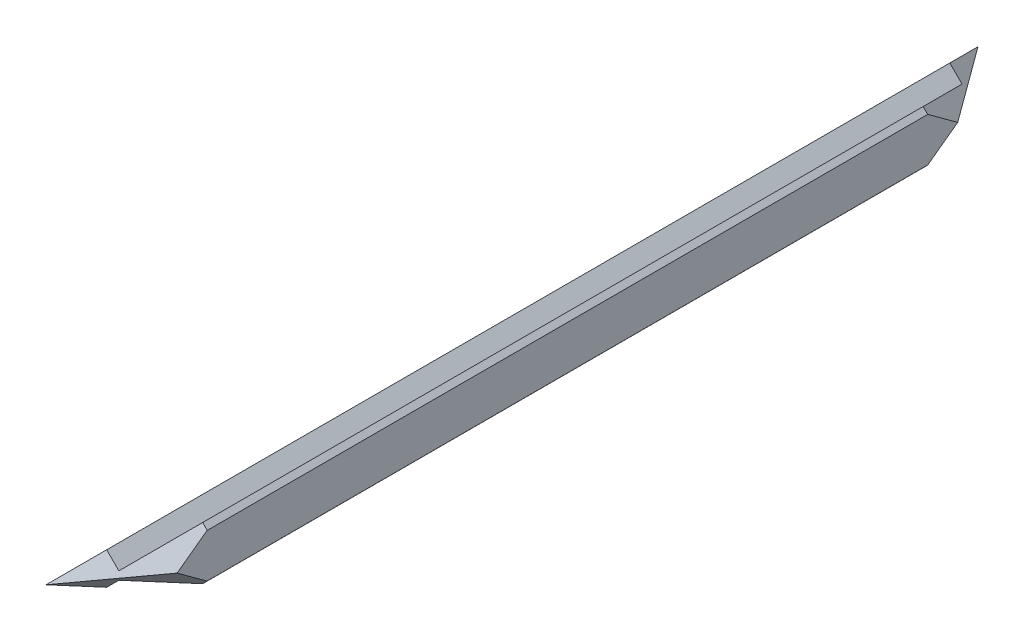
ISO-10303-21;
HEADER;
FILE_DESCRIPTION(('STEP AP214'),'2;1');
FILE_NAME('part.step','',(''),(''),'','','');
FILE_SCHEMA(('AUTOMOTIVE_DESIGN { 1 0 10303 214 1 1 1 1 }'));
ENDSEC;
DATA;
#1=APPLICATION_CONTEXT('core data for automotive mechanical design processes');
#2=APPLICATION_PROTOCOL_DEFINITION('international standard','automotive_design',2000,#1);
#3=PRODUCT_CONTEXT('',#1,'mechanical');
#4=PRODUCT('Part','Part','',(#3));
#5=PRODUCT_RELATED_PRODUCT_CATEGORY('part','',(#4));
#6=PRODUCT_DEFINITION_FORMATION('','',#4);
#7=PRODUCT_DEFINITION_CONTEXT('part definition',#1,'design');
#8=PRODUCT_DEFINITION('design','',#6,#7);
#9=PRODUCT_DEFINITION_SHAPE('','',#8);
#10=(LENGTH_UNIT() NAMED_UNIT(*) SI_UNIT(.MILLI.,.METRE.));
#11=(NAMED_UNIT(*) PLANE_ANGLE_UNIT() SI_UNIT($,.RADIAN.));
#12=(NAMED_UNIT(*) SI_UNIT($,.STERADIAN.) SOLID_ANGLE_UNIT());
#13=UNCERTAINTY_MEASURE_WITH_UNIT(LENGTH_MEASURE(1.E-05),#10,'distance_accuracy_value','');
#14=(GEOMETRIC_REPRESENTATION_CONTEXT(3) GLOBAL_UNCERTAINTY_ASSIGNED_CONTEXT((#13)) GLOBAL_UNIT_ASSIGNED_CONTEXT((#10,
#11,#12)) REPRESENTATION_CONTEXT('',''));
#15=CARTESIAN_POINT('',(0.,0.,0.));
#16=DIRECTION('',(0.,0.,1.));
#17=DIRECTION('',(1.,0.,0.));
#18=AXIS2_PLACEMENT_3D('',#15,#16,#17);
#19=CARTESIAN_POINT('',(-63.9344599593982,-63.9344599593927,46.8032730447738));
#20=DIRECTION('',(-0.627963030199529,-0.627963030199476,0.459700843381125));
#21=DIRECTION('',(0.707106781186518,-0.707106781186577,0.));
#22=AXIS2_PLACEMENT_3D('',#19,#20,#21);
#23=PLANE('',#22);
#24=DIRECTION('',(-0.590690494568928,-1.21765883643594E-13,-0.806898221355033));
#25=VECTOR('',#24,1.);
#26=CARTESIAN_POINT('',(-105.561211175189,1.15740750317173E-11,77.2761698887567));
#27=LINE('',#26,#25);
#28=CARTESIAN_POINT('',(-152.491152925207,2.64752456069495E-09,13.1686772565028));
#29=VERTEX_POINT('',#28);
#30=CARTESIAN_POINT('',(-162.131293748091,0.,0.));
#31=VERTEX_POINT('',#30);
#32=EDGE_CURVE('E40',#29,#31,#27,.T.);
#33=ORIENTED_EDGE('',*,*,#32,.T.);
#34=DIRECTION('',(0.325057583671969,0.325057583671969,0.888073833977042));
#35=VECTOR('',#34,1.);
#36=CARTESIAN_POINT('',(-208.934566792863,-46.8032730447719,-127.868919918785));
#37=LINE('',#36,#35);
#38=CARTESIAN_POINT('',(-159.302866623343,2.82842712474774,7.72740661030882));
#39=VERTEX_POINT('',#38);
#40=EDGE_CURVE('E126',#31,#39,#37,.T.);
#41=ORIENTED_EDGE('',*,*,#40,.T.);
#42=DIRECTION('',(-0.707106781186532,0.707106781186563,0.));
#43=VECTOR('',#42,1.);
#44=CARTESIAN_POINT('',(-157.181546279785,0.707106781189876,7.72740661030882));
#45=LINE('',#44,#43);
#46=CARTESIAN_POINT('',(-157.181546279785,0.707106781189876,7.72740661030882));
#47=VERTEX_POINT('',#46);
#48=EDGE_CURVE('E11',#47,#39,#45,.T.);
#49=ORIENTED_EDGE('',*,*,#48,.F.);
#50=DIRECTION('',(0.325057583671976,0.325057583671961,0.888073833977042));
#51=VECTOR('',#50,1.);
#52=CARTESIAN_POINT('',(-142.87878648988,15.0098665710948,46.803273044773));
#53=LINE('',#52,#51);
#54=CARTESIAN_POINT('',(-153.27478131373,4.61387174724524,18.4008869908032));
#55=VERTEX_POINT('',#54);
#56=EDGE_CURVE('E59',#47,#55,#53,.T.);
#57=ORIENTED_EDGE('',*,*,#56,.T.);
#58=DIRECTION('',(-0.707106781186532,0.707106781186564,0.));
#59=VECTOR('',#58,1.);
#60=CARTESIAN_POINT('',(-149.907185268329,1.24627570184423,18.4008869908032));
#61=LINE('',#60,#59);
#62=CARTESIAN_POINT('',(-152.481031245846,3.82012167936122,18.4008869908032));
#63=VERTEX_POINT('',#62);
#64=EDGE_CURVE('E45',#63,#55,#61,.T.);
#65=ORIENTED_EDGE('',*,*,#64,.F.);
#66=DIRECTION('',(0.325057583671969,0.325057583671969,0.888073833977042));
#67=VECTOR('',#66,1.);
#68=CARTESIAN_POINT('',(-203.720452832323,-47.4192999071158,-121.587816133838));
#69=LINE('',#68,#67);
#70=CARTESIAN_POINT('',(-152.491152925207,3.80999999999997,18.3732340485305));
#71=VERTEX_POINT('',#70);
#72=EDGE_CURVE('E201',#71,#63,#69,.T.);
#73=ORIENTED_EDGE('',*,*,#72,.F.);
#74=DIRECTION('',(0.,0.590690494569039,0.806898221354951));
#75=VECTOR('',#74,1.);
#76=CARTESIAN_POINT('',(-152.491152925207,-133.980405626017,-169.851960434289));
#77=LINE('',#76,#75);
#78=EDGE_CURVE('E139',#29,#71,#77,.T.);
#79=ORIENTED_EDGE('',*,*,#78,.F.);
#80=EDGE_LOOP('',(#33,#41,#49,#57,#65,#73,#79));
#81=FACE_BOUND('',#80,.T.);
#82=ADVANCED_FACE('F36',(#81),#23,.F.);
#83=CARTESIAN_POINT('',(-17.1311869146686,-17.131186914667,-12.5408992154907));
#84=DIRECTION('',(0.62796303019964,0.62796303019958,0.45970084338083));
#85=DIRECTION('',(-0.707106781186514,0.707106781186581,0.));
#86=AXIS2_PLACEMENT_3D('',#83,#84,#85);
#87=PLANE('',#86);
#88=DIRECTION('',(0.32505758367176,0.32505758367176,-0.888073833977194));
#89=VECTOR('',#88,1.);
#90=CARTESIAN_POINT('',(-68.524747658591,93.6065460894998,-93.606546089568));
#91=LINE('',#90,#89);
#92=CARTESIAN_POINT('',(-162.131293748091,0.,162.131293748091));
#93=VERTEX_POINT('',#92);
#94=CARTESIAN_POINT('',(-159.302866623346,2.82842712474437,154.403887137775));
#95=VERTEX_POINT('',#94);
#96=EDGE_CURVE('E203',#93,#95,#91,.T.);
#97=ORIENTED_EDGE('',*,*,#96,.F.);
#98=DIRECTION('',(-0.590690494568685,0.,0.80689822135521));
#99=VECTOR('',#98,1.);
#100=CARTESIAN_POINT('',(-28.2850412864929,0.,-20.7060873158861));
#101=LINE('',#100,#99);
#102=CARTESIAN_POINT('',(-152.491152925207,0.,148.962616487966));
#103=VERTEX_POINT('',#102);
#104=EDGE_CURVE('E213',#103,#93,#101,.T.);
#105=ORIENTED_EDGE('',*,*,#104,.F.);
#106=DIRECTION('',(0.,0.590690494568729,-0.806898221355179));
#107=VECTOR('',#106,1.);
#108=CARTESIAN_POINT('',(-152.491152925207,92.290497704222,22.8914520960423));
#109=LINE('',#108,#107);
#110=CARTESIAN_POINT('',(-152.491152925207,3.80999999999998,143.758059699545));
#111=VERTEX_POINT('',#110);
#112=EDGE_CURVE('E163',#103,#111,#109,.T.);
#113=ORIENTED_EDGE('',*,*,#112,.T.);
#114=DIRECTION('',(0.32505758367176,0.32505758367176,-0.888073833977194));
#115=VECTOR('',#114,1.);
#116=CARTESIAN_POINT('',(-66.6766670715573,89.6244858536497,-90.6914756781249));
#117=LINE('',#116,#115);
#118=CARTESIAN_POINT('',(-152.481031245849,3.82012167935827,143.730406757281));
#119=VERTEX_POINT('',#118);
#120=EDGE_CURVE('E135',#111,#119,#117,.T.);
#121=ORIENTED_EDGE('',*,*,#120,.T.);
#122=DIRECTION('',(-0.707106781186532,0.707106781186564,0.));
#123=VECTOR('',#122,1.);
#124=CARTESIAN_POINT('',(-149.907185268332,1.24627570184124,143.730406757281));
#125=LINE('',#124,#123);
#126=CARTESIAN_POINT('',(-153.274781313733,4.61387174724225,143.730406757281));
#127=VERTEX_POINT('',#126);
#128=EDGE_CURVE('E198',#119,#127,#125,.T.);
#129=ORIENTED_EDGE('',*,*,#128,.T.);
#130=DIRECTION('',(0.325057583671767,0.325057583671753,-0.888073833977194));
#131=VECTOR('',#130,1.);
#132=CARTESIAN_POINT('',(-96.0755134451507,61.8131396158217,-12.5408992154895));
#133=LINE('',#132,#131);
#134=CARTESIAN_POINT('',(-157.181546279789,0.707106781186474,154.403887137775));
#135=VERTEX_POINT('',#134);
#136=EDGE_CURVE('E220',#135,#127,#133,.T.);
#137=ORIENTED_EDGE('',*,*,#136,.F.);
#138=DIRECTION('',(-0.707106781186532,0.707106781186563,0.));
#139=VECTOR('',#138,1.);
#140=CARTESIAN_POINT('',(-157.181546279789,0.707106781186474,154.403887137775));
#141=LINE('',#140,#139);
#142=EDGE_CURVE('E206',#135,#95,#141,.T.);
#143=ORIENTED_EDGE('',*,*,#142,.T.);
#144=EDGE_LOOP('',(#97,#105,#113,#121,#129,#137,#143));
#145=FACE_BOUND('',#144,.T.);
#146=ADVANCED_FACE('F244',(#145),#87,.T.);
#147=CARTESIAN_POINT('',(-63.9344599594024,63.9344599594057,46.8032730447577));
#148=DIRECTION('',(0.62796303019955,-0.627963030199582,-0.459700843380951));
#149=DIRECTION('',(0.707106781186566,0.707106781186529,0.));
#150=AXIS2_PLACEMENT_3D('',#147,#148,#149);
#151=PLANE('',#150);
#152=ORIENTED_EDGE('',*,*,#32,.F.);
#153=DIRECTION('',(0.,-0.590690494568829,0.806898221355105));
#154=VECTOR('',#153,1.);
#155=CARTESIAN_POINT('',(-152.491152925207,27.5674249707177,-24.4891255668067));
#156=LINE('',#155,#154);
#157=CARTESIAN_POINT('',(-152.491152925207,-3.81000000000001,18.3732340485388));
#158=VERTEX_POINT('',#157);
#159=EDGE_CURVE('E216',#29,#158,#156,.T.);
#160=ORIENTED_EDGE('',*,*,#159,.T.);
#161=DIRECTION('',(0.325057583671846,-0.325057583671846,0.888073833977132));
#162=VECTOR('',#161,1.);
#163=CARTESIAN_POINT('',(-113.479940116298,-42.821212808909,124.953849507369));
#164=LINE('',#163,#162);
#165=CARTESIAN_POINT('',(-152.481031245849,-3.82012167935811,18.400886990803));
#166=VERTEX_POINT('',#165);
#167=EDGE_CURVE('E158',#158,#166,#164,.T.);
#168=ORIENTED_EDGE('',*,*,#167,.T.);
#169=DIRECTION('',(-0.707106781186564,-0.707106781186531,0.));
#170=VECTOR('',#169,1.);
#171=CARTESIAN_POINT('',(-149.907185268329,-1.24627570183828,18.4008869908031));
#172=LINE('',#171,#170);
#173=CARTESIAN_POINT('',(-153.27478131373,-4.61387174723914,18.400886990803));
#174=VERTEX_POINT('',#173);
#175=EDGE_CURVE('E209',#166,#174,#172,.T.);
#176=ORIENTED_EDGE('',*,*,#175,.T.);
#177=DIRECTION('',(0.325057583671817,-0.325057583671874,0.888073833977132));
#178=VECTOR('',#177,1.);
#179=CARTESIAN_POINT('',(-142.878786489892,-15.0098665710783,46.8032730447548));
#180=LINE('',#179,#178);
#181=CARTESIAN_POINT('',(-157.181546279785,-0.707106781183089,7.72740661030879));
#182=VERTEX_POINT('',#181);
#183=EDGE_CURVE('E157',#182,#174,#180,.T.);
#184=ORIENTED_EDGE('',*,*,#183,.F.);
#185=DIRECTION('',(-0.707106781186564,-0.707106781186531,0.));
#186=VECTOR('',#185,1.);
#187=CARTESIAN_POINT('',(-157.181546279785,-0.707106781183089,7.72740661030879));
#188=LINE('',#187,#186);
#189=CARTESIAN_POINT('',(-159.302866623346,-2.82842712474424,7.72740661030869));
#190=VERTEX_POINT('',#189);
#191=EDGE_CURVE('E144',#182,#190,#188,.T.);
#192=ORIENTED_EDGE('',*,*,#191,.T.);
#193=DIRECTION('',(0.325057583671846,-0.325057583671846,0.888073833977132));
#194=VECTOR('',#193,1.);
#195=CARTESIAN_POINT('',(-115.328020703332,-46.8032730447589,127.868919918811));
#196=LINE('',#195,#194);
#197=EDGE_CURVE('E148',#31,#190,#196,.T.);
#198=ORIENTED_EDGE('',*,*,#197,.F.);
#199=EDGE_LOOP('',(#152,#160,#168,#176,#184,#192,#198));
#200=FACE_BOUND('',#199,.T.);
#201=ADVANCED_FACE('F154',(#200),#151,.T.);
#202=CARTESIAN_POINT('',(-152.491152925207,-152.491152925207,-156.301152925207));
#203=DIRECTION('',(-1.,0.,0.));
#204=DIRECTION('',(0.,0.,1.));
#205=AXIS2_PLACEMENT_3D('',#202,#203,#204);
#206=PLANE('',#205);
#207=ORIENTED_EDGE('',*,*,#159,.F.);
#208=ORIENTED_EDGE('',*,*,#78,.T.);
#209=DIRECTION('',(0.,0.,1.));
#210=VECTOR('',#209,1.);
#211=CARTESIAN_POINT('',(-152.491152925207,3.80999999999998,-156.301152925207));
#212=LINE('',#211,#210);
#213=EDGE_CURVE('E176',#71,#111,#212,.T.);
#214=ORIENTED_EDGE('',*,*,#213,.T.);
#215=ORIENTED_EDGE('',*,*,#112,.F.);
#216=DIRECTION('',(0.,-0.590690494568707,-0.806898221355194));
#217=VECTOR('',#216,1.);
#218=CARTESIAN_POINT('',(-152.491152925207,-198.70347835943,-122.471382771463));
#219=LINE('',#218,#217);
#220=CARTESIAN_POINT('',(-152.491152925207,-3.80999999999998,143.758059699545));
#221=VERTEX_POINT('',#220);
#222=EDGE_CURVE('E166',#103,#221,#219,.T.);
#223=ORIENTED_EDGE('',*,*,#222,.T.);
#224=DIRECTION('',(0.,0.,-1.));
#225=VECTOR('',#224,1.);
#226=CARTESIAN_POINT('',(-152.491152925207,-3.80999999999998,156.301152925207));
#227=LINE('',#226,#225);
#228=EDGE_CURVE('E173',#221,#158,#227,.T.);
#229=ORIENTED_EDGE('',*,*,#228,.T.);
#230=EDGE_LOOP('',(#207,#208,#214,#215,#223,#229));
#231=FACE_BOUND('',#230,.T.);
#232=ADVANCED_FACE('F258',(#231),#206,.F.);
#233=CARTESIAN_POINT('',(-162.131293748091,0.,162.131293748091));
#234=DIRECTION('',(-0.707106781186548,-0.707106781186547,0.));
#235=DIRECTION('',(0.,0.,-1.));
#236=AXIS2_PLACEMENT_3D('',#233,#234,#235);
#237=PLANE('',#236);
#238=DIRECTION('',(0.,0.,1.));
#239=VECTOR('',#238,1.);
#240=CARTESIAN_POINT('',(-162.131293748091,0.,0.));
#241=LINE('',#240,#239);
#242=EDGE_CURVE('E131',#31,#93,#241,.T.);
#243=ORIENTED_EDGE('',*,*,#242,.F.);
#244=ORIENTED_EDGE('',*,*,#197,.T.);
#245=DIRECTION('',(0.,0.,1.));
#246=VECTOR('',#245,1.);
#247=CARTESIAN_POINT('',(-159.302866623346,-2.82842712474437,162.131293748091));
#248=LINE('',#247,#246);
#249=CARTESIAN_POINT('',(-159.302866623346,-2.82842712474436,154.403887137775));
#250=VERTEX_POINT('',#249);
#251=EDGE_CURVE('E180',#190,#250,#248,.T.);
#252=ORIENTED_EDGE('',*,*,#251,.T.);
#253=DIRECTION('',(0.325057583671751,-0.325057583671751,-0.888073833977201));
#254=VECTOR('',#253,1.);
#255=CARTESIAN_POINT('',(-162.131293748091,0.,162.131293748091));
#256=LINE('',#255,#254);
#257=EDGE_CURVE('E151',#93,#250,#256,.T.);
#258=ORIENTED_EDGE('',*,*,#257,.F.);
#259=EDGE_LOOP('',(#243,#244,#252,#258));
#260=FACE_BOUND('',#259,.T.);
#261=ADVANCED_FACE('F147',(#260),#237,.T.);
#262=CARTESIAN_POINT('',(-78.9443265304876,-78.944326530484,-3.71847269865436E-12));
#263=DIRECTION('',(-0.707106781186564,-0.707106781186531,0.));
#264=DIRECTION('',(-0.707106781186531,0.707106781186564,0.));
#265=AXIS2_PLACEMENT_3D('',#262,#263,#264);
#266=PLANE('',#265);
#267=DIRECTION('',(0.,0.,1.));
#268=VECTOR('',#267,1.);
#269=CARTESIAN_POINT('',(-157.181546279785,-0.707106781183089,7.72740661030879));
#270=LINE('',#269,#268);
#271=CARTESIAN_POINT('',(-157.181546279789,-0.707106781186658,154.403887137775));
#272=VERTEX_POINT('',#271);
#273=EDGE_CURVE('E183',#182,#272,#270,.T.);
#274=ORIENTED_EDGE('',*,*,#273,.F.);
#275=ORIENTED_EDGE('',*,*,#183,.T.);
#276=DIRECTION('',(0.,0.,1.));
#277=VECTOR('',#276,1.);
#278=CARTESIAN_POINT('',(-153.27478131373,-4.61387174723914,18.400886990803));
#279=LINE('',#278,#277);
#280=CARTESIAN_POINT('',(-153.274781313733,-4.61387174724207,143.730406757281));
#281=VERTEX_POINT('',#280);
#282=EDGE_CURVE('E181',#174,#281,#279,.T.);
#283=ORIENTED_EDGE('',*,*,#282,.T.);
#284=DIRECTION('',(0.325057583671764,-0.325057583671738,-0.888073833977201));
#285=VECTOR('',#284,1.);
#286=CARTESIAN_POINT('',(-96.0755134451512,-61.813139615819,-12.5408992154914));
#287=LINE('',#286,#285);
#288=EDGE_CURVE('E194',#272,#281,#287,.T.);
#289=ORIENTED_EDGE('',*,*,#288,.F.);
#290=EDGE_LOOP('',(#274,#275,#283,#289));
#291=FACE_BOUND('',#290,.T.);
#292=ADVANCED_FACE('F234',(#291),#266,.T.);
#293=CARTESIAN_POINT('',(-157.181546279785,-0.707106781183089,7.72740661030879));
#294=DIRECTION('',(0.707106781186531,-0.707106781186564,0.));
#295=DIRECTION('',(0.707106781186564,0.707106781186531,0.));
#296=AXIS2_PLACEMENT_3D('',#293,#294,#295);
#297=PLANE('',#296);
#298=ORIENTED_EDGE('',*,*,#273,.T.);
#299=DIRECTION('',(-0.707106781186564,-0.707106781186531,0.));
#300=VECTOR('',#299,1.);
#301=CARTESIAN_POINT('',(-157.181546279789,-0.707106781186658,154.403887137775));
#302=LINE('',#301,#300);
#303=EDGE_CURVE('E188',#272,#250,#302,.T.);
#304=ORIENTED_EDGE('',*,*,#303,.T.);
#305=ORIENTED_EDGE('',*,*,#251,.F.);
#306=ORIENTED_EDGE('',*,*,#191,.F.);
#307=EDGE_LOOP('',(#298,#304,#305,#306));
#308=FACE_BOUND('',#307,.T.);
#309=ADVANCED_FACE('F237',(#308),#297,.T.);
#310=CARTESIAN_POINT('',(-156.301152925207,0.,156.301152925207));
#311=DIRECTION('',(-0.707106781186547,-0.707106781186548,0.));
#312=DIRECTION('',(0.,0.,-1.));
#313=AXIS2_PLACEMENT_3D('',#310,#311,#312);
#314=PLANE('',#313);
#315=ORIENTED_EDGE('',*,*,#167,.F.);
#316=ORIENTED_EDGE('',*,*,#228,.F.);
#317=DIRECTION('',(0.325057583671751,-0.325057583671751,-0.888073833977201));
#318=VECTOR('',#317,1.);
#319=CARTESIAN_POINT('',(-156.917179787553,0.616026862345548,155.850189963143));
#320=LINE('',#319,#318);
#321=CARTESIAN_POINT('',(-152.481031245849,-3.82012167935813,143.73040675728));
#322=VERTEX_POINT('',#321);
#323=EDGE_CURVE('E191',#221,#322,#320,.T.);
#324=ORIENTED_EDGE('',*,*,#323,.T.);
#325=DIRECTION('',(0.,0.,-1.));
#326=VECTOR('',#325,1.);
#327=CARTESIAN_POINT('',(-152.481031245849,-3.82012167935811,18.4008869908031));
#328=LINE('',#327,#326);
#329=EDGE_CURVE('E177',#322,#166,#328,.T.);
#330=ORIENTED_EDGE('',*,*,#329,.T.);
#331=EDGE_LOOP('',(#315,#316,#324,#330));
#332=FACE_BOUND('',#331,.T.);
#333=ADVANCED_FACE('F38',(#332),#314,.F.);
#334=CARTESIAN_POINT('',(-149.907185268329,-1.24627570183828,18.4008869908031));
#335=DIRECTION('',(0.707106781186531,-0.707106781186564,0.));
#336=DIRECTION('',(0.707106781186564,0.707106781186531,0.));
#337=AXIS2_PLACEMENT_3D('',#334,#335,#336);
#338=PLANE('',#337);
#339=ORIENTED_EDGE('',*,*,#329,.F.);
#340=DIRECTION('',(-0.707106781186564,-0.707106781186531,0.));
#341=VECTOR('',#340,1.);
#342=CARTESIAN_POINT('',(-149.907185268332,-1.24627570184125,143.730406757281));
#343=LINE('',#342,#341);
#344=EDGE_CURVE('E179',#322,#281,#343,.T.);
#345=ORIENTED_EDGE('',*,*,#344,.T.);
#346=ORIENTED_EDGE('',*,*,#282,.F.);
#347=ORIENTED_EDGE('',*,*,#175,.F.);
#348=EDGE_LOOP('',(#339,#345,#346,#347));
#349=FACE_BOUND('',#348,.T.);
#350=ADVANCED_FACE('F230',(#349),#338,.T.);
#351=CARTESIAN_POINT('',(-162.131293748091,0.,-162.131293748091));
#352=DIRECTION('',(-0.707106781186547,0.707106781186548,0.));
#353=DIRECTION('',(0.,0.,1.));
#354=AXIS2_PLACEMENT_3D('',#351,#352,#353);
#355=PLANE('',#354);
#356=ORIENTED_EDGE('',*,*,#40,.F.);
#357=ORIENTED_EDGE('',*,*,#242,.T.);
#358=ORIENTED_EDGE('',*,*,#96,.T.);
#359=DIRECTION('',(0.,0.,1.));
#360=VECTOR('',#359,1.);
#361=CARTESIAN_POINT('',(-159.302866623339,2.82842712475165,-162.131293748091));
#362=LINE('',#361,#360);
#363=EDGE_CURVE('E133',#39,#95,#362,.T.);
#364=ORIENTED_EDGE('',*,*,#363,.F.);
#365=EDGE_LOOP('',(#356,#357,#358,#364));
#366=FACE_BOUND('',#365,.T.);
#367=ADVANCED_FACE('F128',(#366),#355,.T.);
#368=CARTESIAN_POINT('',(-78.944326530484,78.9443265304876,0.));
#369=DIRECTION('',(-0.707106781186531,0.707106781186563,0.));
#370=DIRECTION('',(-0.707106781186564,-0.707106781186532,0.));
#371=AXIS2_PLACEMENT_3D('',#368,#369,#370);
#372=PLANE('',#371);
#373=ORIENTED_EDGE('',*,*,#56,.F.);
#374=DIRECTION('',(0.,0.,1.));
#375=VECTOR('',#374,1.);
#376=CARTESIAN_POINT('',(-157.181546279785,0.707106781189876,7.72740661030882));
#377=LINE('',#376,#375);
#378=EDGE_CURVE('E152',#47,#135,#377,.T.);
#379=ORIENTED_EDGE('',*,*,#378,.T.);
#380=ORIENTED_EDGE('',*,*,#136,.T.);
#381=DIRECTION('',(0.,0.,1.));
#382=VECTOR('',#381,1.);
#383=CARTESIAN_POINT('',(-153.27478131373,4.61387174724524,18.4008869908032));
#384=LINE('',#383,#382);
#385=EDGE_CURVE('E169',#55,#127,#384,.T.);
#386=ORIENTED_EDGE('',*,*,#385,.F.);
#387=EDGE_LOOP('',(#373,#379,#380,#386));
#388=FACE_BOUND('',#387,.T.);
#389=ADVANCED_FACE('F249',(#388),#372,.T.);
#390=CARTESIAN_POINT('',(-156.301152925207,0.,-156.301152925207));
#391=DIRECTION('',(-0.707106781186547,0.707106781186547,0.));
#392=DIRECTION('',(0.,0.,1.));
#393=AXIS2_PLACEMENT_3D('',#390,#391,#392);
#394=PLANE('',#393);
#395=ORIENTED_EDGE('',*,*,#213,.F.);
#396=ORIENTED_EDGE('',*,*,#72,.T.);
#397=DIRECTION('',(0.,0.,-1.));
#398=VECTOR('',#397,1.);
#399=CARTESIAN_POINT('',(-152.481031245846,3.82012167936123,18.4008869908032));
#400=LINE('',#399,#398);
#401=EDGE_CURVE('E171',#119,#63,#400,.T.);
#402=ORIENTED_EDGE('',*,*,#401,.F.);
#403=ORIENTED_EDGE('',*,*,#120,.F.);
#404=EDGE_LOOP('',(#395,#396,#402,#403));
#405=FACE_BOUND('',#404,.T.);
#406=ADVANCED_FACE('F256',(#405),#394,.F.);
#407=CARTESIAN_POINT('',(-149.907185268329,1.24627570184423,18.4008869908032));
#408=DIRECTION('',(-0.707106781186564,-0.707106781186532,0.));
#409=DIRECTION('',(0.707106781186531,-0.707106781186564,0.));
#410=AXIS2_PLACEMENT_3D('',#407,#408,#409);
#411=PLANE('',#410);
#412=ORIENTED_EDGE('',*,*,#401,.T.);
#413=ORIENTED_EDGE('',*,*,#64,.T.);
#414=ORIENTED_EDGE('',*,*,#385,.T.);
#415=ORIENTED_EDGE('',*,*,#128,.F.);
#416=EDGE_LOOP('',(#412,#413,#414,#415));
#417=FACE_BOUND('',#416,.T.);
#418=ADVANCED_FACE('F252',(#417),#411,.F.);
#419=CARTESIAN_POINT('',(-157.181546279785,0.707106781189876,7.72740661030882));
#420=DIRECTION('',(-0.707106781186563,-0.707106781186532,0.));
#421=DIRECTION('',(0.707106781186532,-0.707106781186563,0.));
#422=AXIS2_PLACEMENT_3D('',#419,#420,#421);
#423=PLANE('',#422);
#424=ORIENTED_EDGE('',*,*,#378,.F.);
#425=ORIENTED_EDGE('',*,*,#48,.T.);
#426=ORIENTED_EDGE('',*,*,#363,.T.);
#427=ORIENTED_EDGE('',*,*,#142,.F.);
#428=EDGE_LOOP('',(#424,#425,#426,#427));
#429=FACE_BOUND('',#428,.T.);
#430=ADVANCED_FACE('F248',(#429),#423,.F.);
#431=CARTESIAN_POINT('',(-17.1311869146691,17.1311869146681,-12.5408992154908));
#432=DIRECTION('',(-0.627963030199633,0.627963030199597,-0.459700843380817));
#433=DIRECTION('',(-0.707106781186527,-0.707106781186568,0.));
#434=AXIS2_PLACEMENT_3D('',#431,#432,#433);
#435=PLANE('',#434);
#436=ORIENTED_EDGE('',*,*,#222,.F.);
#437=ORIENTED_EDGE('',*,*,#104,.T.);
#438=ORIENTED_EDGE('',*,*,#257,.T.);
#439=ORIENTED_EDGE('',*,*,#303,.F.);
#440=ORIENTED_EDGE('',*,*,#288,.T.);
#441=ORIENTED_EDGE('',*,*,#344,.F.);
#442=ORIENTED_EDGE('',*,*,#323,.F.);
#443=EDGE_LOOP('',(#436,#437,#438,#439,#440,#441,#442));
#444=FACE_BOUND('',#443,.T.);
#445=ADVANCED_FACE('F239',(#444),#435,.F.);
#446=CLOSED_SHELL('',(#82,#146,#201,#232,#261,#292,#309,#333,#350,#367,#389,#406,#418,#430,#445));
#447=MANIFOLD_SOLID_BREP('B2',#446);
#448=ADVANCED_BREP_SHAPE_REPRESENTATION('',(#18,#447),#14);
#449=SHAPE_DEFINITION_REPRESENTATION(#9,#448);
ENDSEC;
END-ISO-10303-21;
